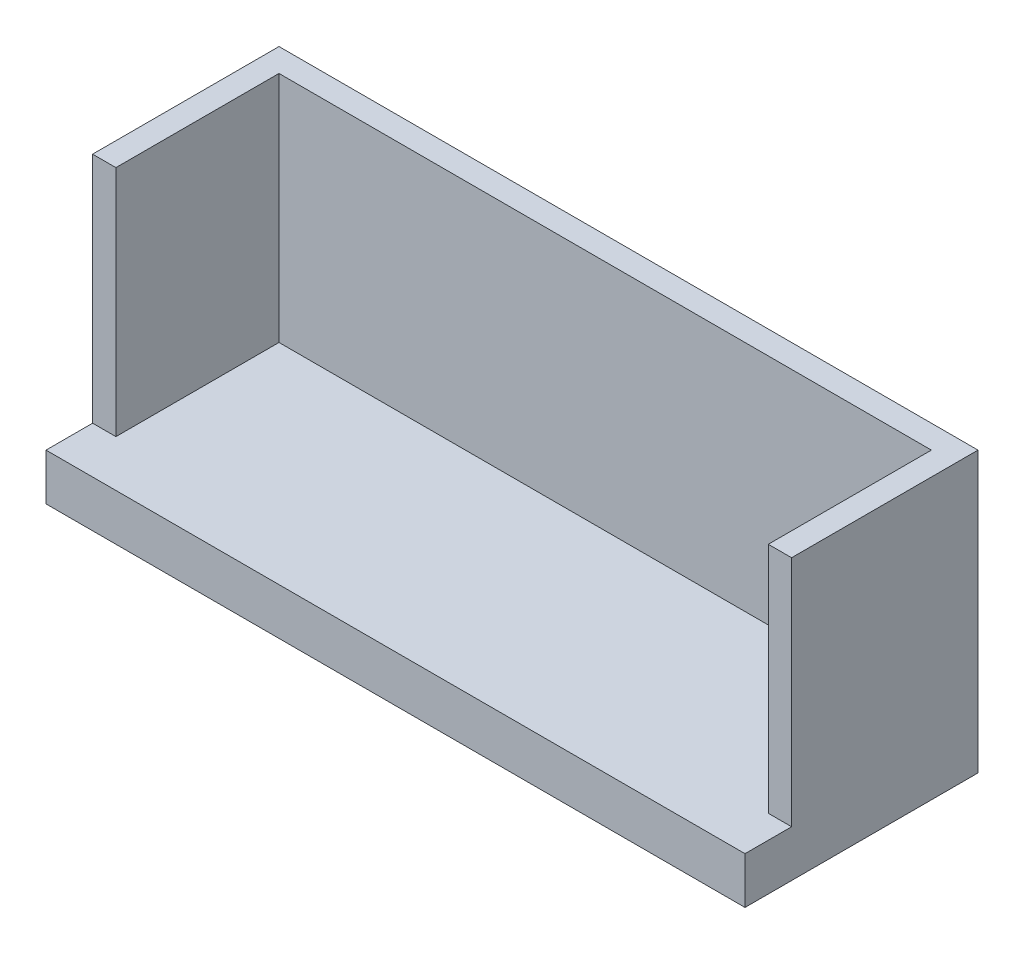
ISO-10303-21;
HEADER;
FILE_DESCRIPTION(('STEP AP214'),'2;1');
FILE_NAME('part.step','',(''),(''),'','','');
FILE_SCHEMA(('AUTOMOTIVE_DESIGN { 1 0 10303 214 1 1 1 1 }'));
ENDSEC;
DATA;
#1=APPLICATION_CONTEXT('core data for automotive mechanical design processes');
#2=APPLICATION_PROTOCOL_DEFINITION('international standard','automotive_design',2000,#1);
#3=PRODUCT_CONTEXT('',#1,'mechanical');
#4=PRODUCT('Part','Part','',(#3));
#5=PRODUCT_RELATED_PRODUCT_CATEGORY('part','',(#4));
#6=PRODUCT_DEFINITION_FORMATION('','',#4);
#7=PRODUCT_DEFINITION_CONTEXT('part definition',#1,'design');
#8=PRODUCT_DEFINITION('design','',#6,#7);
#9=PRODUCT_DEFINITION_SHAPE('','',#8);
#10=(LENGTH_UNIT() NAMED_UNIT(*) SI_UNIT(.MILLI.,.METRE.));
#11=(NAMED_UNIT(*) PLANE_ANGLE_UNIT() SI_UNIT($,.RADIAN.));
#12=(NAMED_UNIT(*) SI_UNIT($,.STERADIAN.) SOLID_ANGLE_UNIT());
#13=UNCERTAINTY_MEASURE_WITH_UNIT(LENGTH_MEASURE(1.E-05),#10,'distance_accuracy_value','');
#14=(GEOMETRIC_REPRESENTATION_CONTEXT(3) GLOBAL_UNCERTAINTY_ASSIGNED_CONTEXT((#13)) GLOBAL_UNIT_ASSIGNED_CONTEXT((#10,
#11,#12)) REPRESENTATION_CONTEXT('',''));
#15=CARTESIAN_POINT('',(0.,0.,0.));
#16=DIRECTION('',(0.,0.,1.));
#17=DIRECTION('',(1.,0.,0.));
#18=AXIS2_PLACEMENT_3D('',#15,#16,#17);
#19=CARTESIAN_POINT('',(7.5,1.,-2.5));
#20=DIRECTION('',(-1.,0.,0.));
#21=DIRECTION('',(0.,0.,1.));
#22=AXIS2_PLACEMENT_3D('',#19,#20,#21);
#23=PLANE('',#22);
#24=DIRECTION('',(0.,0.,-1.));
#25=VECTOR('',#24,1.);
#26=CARTESIAN_POINT('',(7.5,0.,-2.5));
#27=LINE('',#26,#25);
#28=CARTESIAN_POINT('',(7.5,0.,2.5));
#29=VERTEX_POINT('',#28);
#30=CARTESIAN_POINT('',(7.5,0.,-2.5));
#31=VERTEX_POINT('',#30);
#32=EDGE_CURVE('E141',#29,#31,#27,.T.);
#33=ORIENTED_EDGE('',*,*,#32,.T.);
#34=DIRECTION('',(0.,-1.,0.));
#35=VECTOR('',#34,1.);
#36=CARTESIAN_POINT('',(7.5,1.,-2.5));
#37=LINE('',#36,#35);
#38=CARTESIAN_POINT('',(7.5,6.,-2.5));
#39=VERTEX_POINT('',#38);
#40=EDGE_CURVE('E11',#39,#31,#37,.T.);
#41=ORIENTED_EDGE('',*,*,#40,.F.);
#42=DIRECTION('',(0.,0.,-1.));
#43=VECTOR('',#42,1.);
#44=CARTESIAN_POINT('',(7.5,6.,1.5));
#45=LINE('',#44,#43);
#46=CARTESIAN_POINT('',(7.5,6.,1.5));
#47=VERTEX_POINT('',#46);
#48=EDGE_CURVE('E213',#47,#39,#45,.T.);
#49=ORIENTED_EDGE('',*,*,#48,.F.);
#50=DIRECTION('',(0.,-1.,0.));
#51=VECTOR('',#50,1.);
#52=CARTESIAN_POINT('',(7.5,6.,1.5));
#53=LINE('',#52,#51);
#54=CARTESIAN_POINT('',(7.5,1.,1.5));
#55=VERTEX_POINT('',#54);
#56=EDGE_CURVE('E180',#47,#55,#53,.T.);
#57=ORIENTED_EDGE('',*,*,#56,.T.);
#58=DIRECTION('',(0.,0.,-1.));
#59=VECTOR('',#58,1.);
#60=CARTESIAN_POINT('',(7.5,1.,-2.5));
#61=LINE('',#60,#59);
#62=CARTESIAN_POINT('',(7.5,1.,2.5));
#63=VERTEX_POINT('',#62);
#64=EDGE_CURVE('E150',#63,#55,#61,.T.);
#65=ORIENTED_EDGE('',*,*,#64,.F.);
#66=DIRECTION('',(0.,-1.,0.));
#67=VECTOR('',#66,1.);
#68=CARTESIAN_POINT('',(7.5,1.,2.5));
#69=LINE('',#68,#67);
#70=EDGE_CURVE('E155',#63,#29,#69,.T.);
#71=ORIENTED_EDGE('',*,*,#70,.T.);
#72=EDGE_LOOP('',(#33,#41,#49,#57,#65,#71));
#73=FACE_BOUND('',#72,.T.);
#74=ADVANCED_FACE('F41',(#73),#23,.F.);
#75=CARTESIAN_POINT('',(-7.5,1.,-2.5));
#76=DIRECTION('',(0.,0.,1.));
#77=DIRECTION('',(1.,0.,0.));
#78=AXIS2_PLACEMENT_3D('',#75,#76,#77);
#79=PLANE('',#78);
#80=DIRECTION('',(-1.,0.,0.));
#81=VECTOR('',#80,1.);
#82=CARTESIAN_POINT('',(-7.5,0.,-2.5));
#83=LINE('',#82,#81);
#84=CARTESIAN_POINT('',(-7.5,0.,-2.5));
#85=VERTEX_POINT('',#84);
#86=EDGE_CURVE('E144',#31,#85,#83,.T.);
#87=ORIENTED_EDGE('',*,*,#86,.T.);
#88=DIRECTION('',(0.,-1.,0.));
#89=VECTOR('',#88,1.);
#90=CARTESIAN_POINT('',(-7.5,1.,-2.5));
#91=LINE('',#90,#89);
#92=CARTESIAN_POINT('',(-7.5,6.,-2.5));
#93=VERTEX_POINT('',#92);
#94=EDGE_CURVE('E48',#93,#85,#91,.T.);
#95=ORIENTED_EDGE('',*,*,#94,.F.);
#96=DIRECTION('',(-1.,0.,0.));
#97=VECTOR('',#96,1.);
#98=CARTESIAN_POINT('',(7.5,6.,-2.5));
#99=LINE('',#98,#97);
#100=EDGE_CURVE('E133',#39,#93,#99,.T.);
#101=ORIENTED_EDGE('',*,*,#100,.F.);
#102=ORIENTED_EDGE('',*,*,#40,.T.);
#103=EDGE_LOOP('',(#87,#95,#101,#102));
#104=FACE_BOUND('',#103,.T.);
#105=ADVANCED_FACE('F223',(#104),#79,.F.);
#106=CARTESIAN_POINT('',(-7.5,1.,-2.5));
#107=DIRECTION('',(1.,0.,0.));
#108=DIRECTION('',(0.,0.,-1.));
#109=AXIS2_PLACEMENT_3D('',#106,#107,#108);
#110=PLANE('',#109);
#111=DIRECTION('',(0.,0.,1.));
#112=VECTOR('',#111,1.);
#113=CARTESIAN_POINT('',(-7.5,0.,-2.5));
#114=LINE('',#113,#112);
#115=CARTESIAN_POINT('',(-7.5,0.,2.5));
#116=VERTEX_POINT('',#115);
#117=EDGE_CURVE('E158',#85,#116,#114,.T.);
#118=ORIENTED_EDGE('',*,*,#117,.T.);
#119=DIRECTION('',(0.,-1.,0.));
#120=VECTOR('',#119,1.);
#121=CARTESIAN_POINT('',(-7.5,1.,2.5));
#122=LINE('',#121,#120);
#123=CARTESIAN_POINT('',(-7.5,1.,2.5));
#124=VERTEX_POINT('',#123);
#125=EDGE_CURVE('E163',#124,#116,#122,.T.);
#126=ORIENTED_EDGE('',*,*,#125,.F.);
#127=DIRECTION('',(0.,0.,1.));
#128=VECTOR('',#127,1.);
#129=CARTESIAN_POINT('',(-7.5,1.,-2.5));
#130=LINE('',#129,#128);
#131=CARTESIAN_POINT('',(-7.5,1.,1.5));
#132=VERTEX_POINT('',#131);
#133=EDGE_CURVE('E140',#132,#124,#130,.T.);
#134=ORIENTED_EDGE('',*,*,#133,.F.);
#135=DIRECTION('',(0.,-1.,0.));
#136=VECTOR('',#135,1.);
#137=CARTESIAN_POINT('',(-7.5,6.,1.5));
#138=LINE('',#137,#136);
#139=CARTESIAN_POINT('',(-7.5,6.,1.5));
#140=VERTEX_POINT('',#139);
#141=EDGE_CURVE('E120',#140,#132,#138,.T.);
#142=ORIENTED_EDGE('',*,*,#141,.F.);
#143=DIRECTION('',(0.,0.,1.));
#144=VECTOR('',#143,1.);
#145=CARTESIAN_POINT('',(-7.5,6.,-2.5));
#146=LINE('',#145,#144);
#147=EDGE_CURVE('E126',#93,#140,#146,.T.);
#148=ORIENTED_EDGE('',*,*,#147,.F.);
#149=ORIENTED_EDGE('',*,*,#94,.T.);
#150=EDGE_LOOP('',(#118,#126,#134,#142,#148,#149));
#151=FACE_BOUND('',#150,.T.);
#152=ADVANCED_FACE('F138',(#151),#110,.F.);
#153=CARTESIAN_POINT('',(-7.5,1.,2.5));
#154=DIRECTION('',(0.,0.,-1.));
#155=DIRECTION('',(-1.,0.,0.));
#156=AXIS2_PLACEMENT_3D('',#153,#154,#155);
#157=PLANE('',#156);
#158=DIRECTION('',(1.,0.,0.));
#159=VECTOR('',#158,1.);
#160=CARTESIAN_POINT('',(-7.5,0.,2.5));
#161=LINE('',#160,#159);
#162=EDGE_CURVE('E152',#116,#29,#161,.T.);
#163=ORIENTED_EDGE('',*,*,#162,.T.);
#164=ORIENTED_EDGE('',*,*,#70,.F.);
#165=DIRECTION('',(1.,0.,0.));
#166=VECTOR('',#165,1.);
#167=CARTESIAN_POINT('',(-7.5,1.,2.5));
#168=LINE('',#167,#166);
#169=EDGE_CURVE('E154',#124,#63,#168,.T.);
#170=ORIENTED_EDGE('',*,*,#169,.F.);
#171=ORIENTED_EDGE('',*,*,#125,.T.);
#172=EDGE_LOOP('',(#163,#164,#170,#171));
#173=FACE_BOUND('',#172,.T.);
#174=ADVANCED_FACE('F173',(#173),#157,.F.);
#175=CARTESIAN_POINT('',(0.,1.,0.));
#176=DIRECTION('',(0.,1.,0.));
#177=DIRECTION('',(0.,0.,1.));
#178=AXIS2_PLACEMENT_3D('',#175,#176,#177);
#179=PLANE('',#178);
#180=DIRECTION('',(1.,0.,0.));
#181=VECTOR('',#180,1.);
#182=CARTESIAN_POINT('',(7.,1.,1.5));
#183=LINE('',#182,#181);
#184=CARTESIAN_POINT('',(7.,1.,1.5));
#185=VERTEX_POINT('',#184);
#186=EDGE_CURVE('E55',#185,#55,#183,.T.);
#187=ORIENTED_EDGE('',*,*,#186,.F.);
#188=DIRECTION('',(0.,0.,1.));
#189=VECTOR('',#188,1.);
#190=CARTESIAN_POINT('',(7.,1.,-2.));
#191=LINE('',#190,#189);
#192=CARTESIAN_POINT('',(7.,1.,-2.));
#193=VERTEX_POINT('',#192);
#194=EDGE_CURVE('E59',#193,#185,#191,.T.);
#195=ORIENTED_EDGE('',*,*,#194,.F.);
#196=DIRECTION('',(1.,0.,0.));
#197=VECTOR('',#196,1.);
#198=CARTESIAN_POINT('',(-7.,1.,-2.));
#199=LINE('',#198,#197);
#200=CARTESIAN_POINT('',(-7.,1.,-2.));
#201=VERTEX_POINT('',#200);
#202=EDGE_CURVE('E189',#201,#193,#199,.T.);
#203=ORIENTED_EDGE('',*,*,#202,.F.);
#204=DIRECTION('',(0.,0.,-1.));
#205=VECTOR('',#204,1.);
#206=CARTESIAN_POINT('',(-7.,1.,1.5));
#207=LINE('',#206,#205);
#208=CARTESIAN_POINT('',(-7.,1.,1.5));
#209=VERTEX_POINT('',#208);
#210=EDGE_CURVE('E207',#209,#201,#207,.T.);
#211=ORIENTED_EDGE('',*,*,#210,.F.);
#212=DIRECTION('',(1.,0.,0.));
#213=VECTOR('',#212,1.);
#214=CARTESIAN_POINT('',(-7.5,1.,1.5));
#215=LINE('',#214,#213);
#216=EDGE_CURVE('E208',#132,#209,#215,.T.);
#217=ORIENTED_EDGE('',*,*,#216,.F.);
#218=ORIENTED_EDGE('',*,*,#133,.T.);
#219=ORIENTED_EDGE('',*,*,#169,.T.);
#220=ORIENTED_EDGE('',*,*,#64,.T.);
#221=EDGE_LOOP('',(#187,#195,#203,#211,#217,#218,#219,#220));
#222=FACE_BOUND('',#221,.T.);
#223=ADVANCED_FACE('F181',(#222),#179,.T.);
#224=CARTESIAN_POINT('',(0.,0.,0.));
#225=DIRECTION('',(0.,1.,0.));
#226=DIRECTION('',(0.,0.,1.));
#227=AXIS2_PLACEMENT_3D('',#224,#225,#226);
#228=PLANE('',#227);
#229=ORIENTED_EDGE('',*,*,#32,.F.);
#230=ORIENTED_EDGE('',*,*,#162,.F.);
#231=ORIENTED_EDGE('',*,*,#117,.F.);
#232=ORIENTED_EDGE('',*,*,#86,.F.);
#233=EDGE_LOOP('',(#229,#230,#231,#232));
#234=FACE_BOUND('',#233,.T.);
#235=ADVANCED_FACE('F170',(#234),#228,.F.);
#236=CARTESIAN_POINT('',(-7.5,6.,1.5));
#237=DIRECTION('',(0.,0.,-1.));
#238=DIRECTION('',(-1.,0.,0.));
#239=AXIS2_PLACEMENT_3D('',#236,#237,#238);
#240=PLANE('',#239);
#241=ORIENTED_EDGE('',*,*,#216,.T.);
#242=DIRECTION('',(0.,-1.,0.));
#243=VECTOR('',#242,1.);
#244=CARTESIAN_POINT('',(-7.,6.,1.5));
#245=LINE('',#244,#243);
#246=CARTESIAN_POINT('',(-7.,6.,1.5));
#247=VERTEX_POINT('',#246);
#248=EDGE_CURVE('E122',#247,#209,#245,.T.);
#249=ORIENTED_EDGE('',*,*,#248,.F.);
#250=DIRECTION('',(1.,0.,0.));
#251=VECTOR('',#250,1.);
#252=CARTESIAN_POINT('',(-7.5,6.,1.5));
#253=LINE('',#252,#251);
#254=EDGE_CURVE('E115',#140,#247,#253,.T.);
#255=ORIENTED_EDGE('',*,*,#254,.F.);
#256=ORIENTED_EDGE('',*,*,#141,.T.);
#257=EDGE_LOOP('',(#241,#249,#255,#256));
#258=FACE_BOUND('',#257,.T.);
#259=ADVANCED_FACE('F118',(#258),#240,.F.);
#260=CARTESIAN_POINT('',(-7.,6.,1.5));
#261=DIRECTION('',(-1.,0.,0.));
#262=DIRECTION('',(0.,0.,1.));
#263=AXIS2_PLACEMENT_3D('',#260,#261,#262);
#264=PLANE('',#263);
#265=ORIENTED_EDGE('',*,*,#210,.T.);
#266=DIRECTION('',(0.,-1.,0.));
#267=VECTOR('',#266,1.);
#268=CARTESIAN_POINT('',(-7.,6.,-2.));
#269=LINE('',#268,#267);
#270=CARTESIAN_POINT('',(-7.,6.,-2.));
#271=VERTEX_POINT('',#270);
#272=EDGE_CURVE('E146',#271,#201,#269,.T.);
#273=ORIENTED_EDGE('',*,*,#272,.F.);
#274=DIRECTION('',(0.,0.,-1.));
#275=VECTOR('',#274,1.);
#276=CARTESIAN_POINT('',(-7.,6.,1.5));
#277=LINE('',#276,#275);
#278=EDGE_CURVE('E125',#247,#271,#277,.T.);
#279=ORIENTED_EDGE('',*,*,#278,.F.);
#280=ORIENTED_EDGE('',*,*,#248,.T.);
#281=EDGE_LOOP('',(#265,#273,#279,#280));
#282=FACE_BOUND('',#281,.T.);
#283=ADVANCED_FACE('F206',(#282),#264,.F.);
#284=CARTESIAN_POINT('',(-7.,6.,-2.));
#285=DIRECTION('',(0.,0.,-1.));
#286=DIRECTION('',(-1.,0.,0.));
#287=AXIS2_PLACEMENT_3D('',#284,#285,#286);
#288=PLANE('',#287);
#289=ORIENTED_EDGE('',*,*,#202,.T.);
#290=DIRECTION('',(0.,-1.,0.));
#291=VECTOR('',#290,1.);
#292=CARTESIAN_POINT('',(7.,6.,-2.));
#293=LINE('',#292,#291);
#294=CARTESIAN_POINT('',(7.,6.,-2.));
#295=VERTEX_POINT('',#294);
#296=EDGE_CURVE('E195',#295,#193,#293,.T.);
#297=ORIENTED_EDGE('',*,*,#296,.F.);
#298=DIRECTION('',(1.,0.,0.));
#299=VECTOR('',#298,1.);
#300=CARTESIAN_POINT('',(-7.,6.,-2.));
#301=LINE('',#300,#299);
#302=EDGE_CURVE('E203',#271,#295,#301,.T.);
#303=ORIENTED_EDGE('',*,*,#302,.F.);
#304=ORIENTED_EDGE('',*,*,#272,.T.);
#305=EDGE_LOOP('',(#289,#297,#303,#304));
#306=FACE_BOUND('',#305,.T.);
#307=ADVANCED_FACE('F201',(#306),#288,.F.);
#308=CARTESIAN_POINT('',(7.,6.,-2.));
#309=DIRECTION('',(1.,0.,0.));
#310=DIRECTION('',(0.,0.,-1.));
#311=AXIS2_PLACEMENT_3D('',#308,#309,#310);
#312=PLANE('',#311);
#313=ORIENTED_EDGE('',*,*,#194,.T.);
#314=DIRECTION('',(0.,-1.,0.));
#315=VECTOR('',#314,1.);
#316=CARTESIAN_POINT('',(7.,6.,1.5));
#317=LINE('',#316,#315);
#318=CARTESIAN_POINT('',(7.,6.,1.5));
#319=VERTEX_POINT('',#318);
#320=EDGE_CURVE('E187',#319,#185,#317,.T.);
#321=ORIENTED_EDGE('',*,*,#320,.F.);
#322=DIRECTION('',(0.,0.,1.));
#323=VECTOR('',#322,1.);
#324=CARTESIAN_POINT('',(7.,6.,-2.));
#325=LINE('',#324,#323);
#326=EDGE_CURVE('E217',#295,#319,#325,.T.);
#327=ORIENTED_EDGE('',*,*,#326,.F.);
#328=ORIENTED_EDGE('',*,*,#296,.T.);
#329=EDGE_LOOP('',(#313,#321,#327,#328));
#330=FACE_BOUND('',#329,.T.);
#331=ADVANCED_FACE('F222',(#330),#312,.F.);
#332=CARTESIAN_POINT('',(7.,6.,1.5));
#333=DIRECTION('',(0.,0.,-1.));
#334=DIRECTION('',(-1.,0.,0.));
#335=AXIS2_PLACEMENT_3D('',#332,#333,#334);
#336=PLANE('',#335);
#337=ORIENTED_EDGE('',*,*,#186,.T.);
#338=ORIENTED_EDGE('',*,*,#56,.F.);
#339=DIRECTION('',(1.,0.,0.));
#340=VECTOR('',#339,1.);
#341=CARTESIAN_POINT('',(7.,6.,1.5));
#342=LINE('',#341,#340);
#343=EDGE_CURVE('E215',#319,#47,#342,.T.);
#344=ORIENTED_EDGE('',*,*,#343,.F.);
#345=ORIENTED_EDGE('',*,*,#320,.T.);
#346=EDGE_LOOP('',(#337,#338,#344,#345));
#347=FACE_BOUND('',#346,.T.);
#348=ADVANCED_FACE('F184',(#347),#336,.F.);
#349=CARTESIAN_POINT('',(0.,6.,0.));
#350=DIRECTION('',(0.,1.,0.));
#351=DIRECTION('',(0.,0.,1.));
#352=AXIS2_PLACEMENT_3D('',#349,#350,#351);
#353=PLANE('',#352);
#354=ORIENTED_EDGE('',*,*,#147,.T.);
#355=ORIENTED_EDGE('',*,*,#254,.T.);
#356=ORIENTED_EDGE('',*,*,#278,.T.);
#357=ORIENTED_EDGE('',*,*,#302,.T.);
#358=ORIENTED_EDGE('',*,*,#326,.T.);
#359=ORIENTED_EDGE('',*,*,#343,.T.);
#360=ORIENTED_EDGE('',*,*,#48,.T.);
#361=ORIENTED_EDGE('',*,*,#100,.T.);
#362=EDGE_LOOP('',(#354,#355,#356,#357,#358,#359,#360,#361));
#363=FACE_BOUND('',#362,.T.);
#364=ADVANCED_FACE('F130',(#363),#353,.T.);
#365=CLOSED_SHELL('',(#74,#105,#152,#174,#223,#235,#259,#283,#307,#331,#348,#364));
#366=MANIFOLD_SOLID_BREP('B2',#365);
#367=ADVANCED_BREP_SHAPE_REPRESENTATION('',(#18,#366),#14);
#368=SHAPE_DEFINITION_REPRESENTATION(#9,#367);
ENDSEC;
END-ISO-10303-21;
